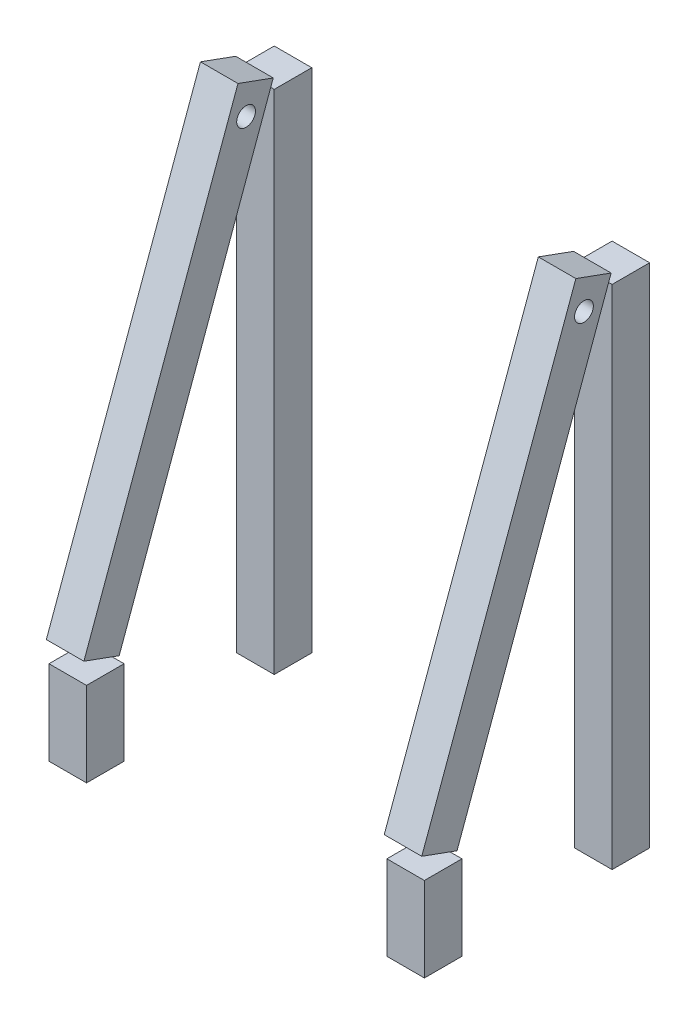
ISO-10303-21;
HEADER;
FILE_DESCRIPTION(('STEP AP214'),'2;1');
FILE_NAME('part.step','',(''),(''),'','','');
FILE_SCHEMA(('AUTOMOTIVE_DESIGN { 1 0 10303 214 1 1 1 1 }'));
ENDSEC;
DATA;
#1=APPLICATION_CONTEXT('core data for automotive mechanical design processes');
#2=APPLICATION_PROTOCOL_DEFINITION('international standard','automotive_design',2000,#1);
#3=PRODUCT_CONTEXT('',#1,'mechanical');
#4=PRODUCT('Part','Part','',(#3));
#5=PRODUCT_RELATED_PRODUCT_CATEGORY('part','',(#4));
#6=PRODUCT_DEFINITION_FORMATION('','',#4);
#7=PRODUCT_DEFINITION_CONTEXT('part definition',#1,'design');
#8=PRODUCT_DEFINITION('design','',#6,#7);
#9=PRODUCT_DEFINITION_SHAPE('','',#8);
#10=(LENGTH_UNIT() NAMED_UNIT(*) SI_UNIT(.MILLI.,.METRE.));
#11=(NAMED_UNIT(*) PLANE_ANGLE_UNIT() SI_UNIT($,.RADIAN.));
#12=(NAMED_UNIT(*) SI_UNIT($,.STERADIAN.) SOLID_ANGLE_UNIT());
#13=UNCERTAINTY_MEASURE_WITH_UNIT(LENGTH_MEASURE(1.E-05),#10,'distance_accuracy_value','');
#14=(GEOMETRIC_REPRESENTATION_CONTEXT(3) GLOBAL_UNCERTAINTY_ASSIGNED_CONTEXT((#13)) GLOBAL_UNIT_ASSIGNED_CONTEXT((#10,
#11,#12)) REPRESENTATION_CONTEXT('',''));
#15=CARTESIAN_POINT('',(0.,0.,0.));
#16=DIRECTION('',(0.,0.,1.));
#17=DIRECTION('',(1.,0.,0.));
#18=AXIS2_PLACEMENT_3D('',#15,#16,#17);
#19=CARTESIAN_POINT('',(-254.,0.,0.));
#20=DIRECTION('',(1.,0.,0.));
#21=DIRECTION('',(0.,0.,-1.));
#22=AXIS2_PLACEMENT_3D('',#19,#20,#21);
#23=PLANE('',#22);
#24=DIRECTION('',(0.,0.342020143325662,0.939692620785911));
#25=VECTOR('',#24,1.);
#26=CARTESIAN_POINT('',(-254.,123.38224622754,110.994332712899));
#27=LINE('',#26,#25);
#28=CARTESIAN_POINT('',(-254.,127.,120.934029511881));
#29=VERTEX_POINT('',#28);
#30=CARTESIAN_POINT('',(-254.,144.374623280944,168.670414647805));
#31=VERTEX_POINT('',#30);
#32=EDGE_CURVE('E99',#29,#31,#27,.T.);
#33=ORIENTED_EDGE('',*,*,#32,.T.);
#34=DIRECTION('',(0.,-0.939692620785911,0.342020143325663));
#35=VECTOR('',#34,1.);
#36=CARTESIAN_POINT('',(-254.,135.292377053404,171.976081934906));
#37=LINE('',#36,#35);
#38=CARTESIAN_POINT('',(-254.,717.211244912035,-39.8250647235188));
#39=VERTEX_POINT('',#38);
#40=EDGE_CURVE('E106',#39,#31,#37,.T.);
#41=ORIENTED_EDGE('',*,*,#40,.F.);
#42=DIRECTION('',(0.,0.342020143325662,0.939692620785911));
#43=VECTOR('',#42,1.);
#44=CARTESIAN_POINT('',(-254.,696.218867858631,-97.5011466584247));
#45=LINE('',#44,#43);
#46=CARTESIAN_POINT('',(-254.,699.836621631091,-87.5614498594431));
#47=VERTEX_POINT('',#46);
#48=EDGE_CURVE('E114',#47,#39,#45,.T.);
#49=ORIENTED_EDGE('',*,*,#48,.F.);
#50=DIRECTION('',(0.,-0.939692620785911,0.342020143325663));
#51=VECTOR('',#50,1.);
#52=CARTESIAN_POINT('',(-254.,117.91775377246,124.239696798982));
#53=LINE('',#52,#51);
#54=EDGE_CURVE('E76',#47,#29,#53,.T.);
#55=ORIENTED_EDGE('',*,*,#54,.T.);
#56=EDGE_LOOP('',(#33,#41,#49,#55));
#57=FACE_BOUND('',#56,.T.);
#58=CARTESIAN_POINT('',(-254.,673.1,-50.8));
#59=DIRECTION('',(-1.,0.,0.));
#60=DIRECTION('',(0.,0.,1.));
#61=AXIS2_PLACEMENT_3D('',#58,#59,#60);
#62=CIRCLE('',#61,12.7);
#63=CARTESIAN_POINT('',(-254.,673.1,-38.1));
#64=VERTEX_POINT('',#63);
#65=EDGE_CURVE('E125',#64,#64,#62,.T.);
#66=ORIENTED_EDGE('',*,*,#65,.F.);
#67=EDGE_LOOP('',(#66));
#68=FACE_BOUND('',#67,.T.);
#69=ADVANCED_FACE('F59',(#57,#68),#23,.F.);
#70=CARTESIAN_POINT('',(-203.2,0.,0.));
#71=DIRECTION('',(1.,0.,0.));
#72=DIRECTION('',(0.,0.,-1.));
#73=AXIS2_PLACEMENT_3D('',#70,#71,#72);
#74=PLANE('',#73);
#75=DIRECTION('',(0.,0.342020143325662,0.939692620785911));
#76=VECTOR('',#75,1.);
#77=CARTESIAN_POINT('',(-203.2,123.38224622754,110.994332712899));
#78=LINE('',#77,#76);
#79=CARTESIAN_POINT('',(-203.2,127.,120.934029511881));
#80=VERTEX_POINT('',#79);
#81=CARTESIAN_POINT('',(-203.2,144.374623280944,168.670414647805));
#82=VERTEX_POINT('',#81);
#83=EDGE_CURVE('E122',#80,#82,#78,.T.);
#84=ORIENTED_EDGE('',*,*,#83,.F.);
#85=DIRECTION('',(0.,-0.939692620785911,0.342020143325663));
#86=VECTOR('',#85,1.);
#87=CARTESIAN_POINT('',(-203.2,117.91775377246,124.239696798982));
#88=LINE('',#87,#86);
#89=CARTESIAN_POINT('',(-203.2,699.836621631091,-87.5614498594431));
#90=VERTEX_POINT('',#89);
#91=EDGE_CURVE('E94',#90,#80,#88,.T.);
#92=ORIENTED_EDGE('',*,*,#91,.F.);
#93=DIRECTION('',(0.,0.342020143325662,0.939692620785911));
#94=VECTOR('',#93,1.);
#95=CARTESIAN_POINT('',(-203.2,696.218867858631,-97.5011466584247));
#96=LINE('',#95,#94);
#97=CARTESIAN_POINT('',(-203.2,717.211244912035,-39.8250647235188));
#98=VERTEX_POINT('',#97);
#99=EDGE_CURVE('E127',#90,#98,#96,.T.);
#100=ORIENTED_EDGE('',*,*,#99,.T.);
#101=DIRECTION('',(0.,-0.939692620785911,0.342020143325663));
#102=VECTOR('',#101,1.);
#103=CARTESIAN_POINT('',(-203.2,135.292377053404,171.976081934906));
#104=LINE('',#103,#102);
#105=EDGE_CURVE('E108',#98,#82,#104,.T.);
#106=ORIENTED_EDGE('',*,*,#105,.T.);
#107=EDGE_LOOP('',(#84,#92,#100,#106));
#108=FACE_BOUND('',#107,.T.);
#109=CARTESIAN_POINT('',(-203.2,673.1,-50.8));
#110=DIRECTION('',(-1.,0.,0.));
#111=DIRECTION('',(0.,0.,1.));
#112=AXIS2_PLACEMENT_3D('',#109,#110,#111);
#113=CIRCLE('',#112,12.7);
#114=CARTESIAN_POINT('',(-203.2,673.1,-38.1));
#115=VERTEX_POINT('',#114);
#116=EDGE_CURVE('E140',#115,#115,#113,.T.);
#117=ORIENTED_EDGE('',*,*,#116,.T.);
#118=EDGE_LOOP('',(#117));
#119=FACE_BOUND('',#118,.T.);
#120=ADVANCED_FACE('F134',(#108,#119),#74,.T.);
#121=CARTESIAN_POINT('',(-254.,123.38224622754,110.994332712899));
#122=DIRECTION('',(0.,0.939692620785911,-0.342020143325662));
#123=DIRECTION('',(0.,0.342020143325662,0.939692620785911));
#124=AXIS2_PLACEMENT_3D('',#121,#122,#123);
#125=PLANE('',#124);
#126=ORIENTED_EDGE('',*,*,#83,.T.);
#127=DIRECTION('',(1.,0.,0.));
#128=VECTOR('',#127,1.);
#129=CARTESIAN_POINT('',(-254.,144.374623280944,168.670414647805));
#130=LINE('',#129,#128);
#131=EDGE_CURVE('E13',#31,#82,#130,.T.);
#132=ORIENTED_EDGE('',*,*,#131,.F.);
#133=ORIENTED_EDGE('',*,*,#32,.F.);
#134=DIRECTION('',(1.,0.,0.));
#135=VECTOR('',#134,1.);
#136=CARTESIAN_POINT('',(-254.,127.,120.934029511881));
#137=LINE('',#136,#135);
#138=EDGE_CURVE('E118',#29,#80,#137,.T.);
#139=ORIENTED_EDGE('',*,*,#138,.T.);
#140=EDGE_LOOP('',(#126,#132,#133,#139));
#141=FACE_BOUND('',#140,.T.);
#142=ADVANCED_FACE('F61',(#141),#125,.F.);
#143=CARTESIAN_POINT('',(-254.,135.292377053404,171.976081934906));
#144=DIRECTION('',(0.,0.342020143325663,0.939692620785911));
#145=DIRECTION('',(0.,-0.939692620785911,0.342020143325663));
#146=AXIS2_PLACEMENT_3D('',#143,#144,#145);
#147=PLANE('',#146);
#148=ORIENTED_EDGE('',*,*,#105,.F.);
#149=DIRECTION('',(1.,0.,0.));
#150=VECTOR('',#149,1.);
#151=CARTESIAN_POINT('',(-254.,717.211244912035,-39.8250647235188));
#152=LINE('',#151,#150);
#153=EDGE_CURVE('E68',#39,#98,#152,.T.);
#154=ORIENTED_EDGE('',*,*,#153,.F.);
#155=ORIENTED_EDGE('',*,*,#40,.T.);
#156=ORIENTED_EDGE('',*,*,#131,.T.);
#157=EDGE_LOOP('',(#148,#154,#155,#156));
#158=FACE_BOUND('',#157,.T.);
#159=ADVANCED_FACE('F105',(#158),#147,.T.);
#160=CARTESIAN_POINT('',(-254.,696.218867858631,-97.5011466584247));
#161=DIRECTION('',(0.,0.939692620785911,-0.342020143325662));
#162=DIRECTION('',(0.,0.342020143325662,0.939692620785911));
#163=AXIS2_PLACEMENT_3D('',#160,#161,#162);
#164=PLANE('',#163);
#165=ORIENTED_EDGE('',*,*,#99,.F.);
#166=DIRECTION('',(1.,0.,0.));
#167=VECTOR('',#166,1.);
#168=CARTESIAN_POINT('',(-254.,699.836621631091,-87.5614498594431));
#169=LINE('',#168,#167);
#170=EDGE_CURVE('E91',#47,#90,#169,.T.);
#171=ORIENTED_EDGE('',*,*,#170,.F.);
#172=ORIENTED_EDGE('',*,*,#48,.T.);
#173=ORIENTED_EDGE('',*,*,#153,.T.);
#174=EDGE_LOOP('',(#165,#171,#172,#173));
#175=FACE_BOUND('',#174,.T.);
#176=ADVANCED_FACE('F116',(#175),#164,.T.);
#177=CARTESIAN_POINT('',(-254.,117.91775377246,124.239696798982));
#178=DIRECTION('',(0.,0.342020143325663,0.939692620785911));
#179=DIRECTION('',(0.,-0.939692620785911,0.342020143325663));
#180=AXIS2_PLACEMENT_3D('',#177,#178,#179);
#181=PLANE('',#180);
#182=ORIENTED_EDGE('',*,*,#91,.T.);
#183=ORIENTED_EDGE('',*,*,#138,.F.);
#184=ORIENTED_EDGE('',*,*,#54,.F.);
#185=ORIENTED_EDGE('',*,*,#170,.T.);
#186=EDGE_LOOP('',(#182,#183,#184,#185));
#187=FACE_BOUND('',#186,.T.);
#188=ADVANCED_FACE('F154',(#187),#181,.F.);
#189=CARTESIAN_POINT('',(-254.,673.1,-50.8));
#190=DIRECTION('',(1.,0.,0.));
#191=DIRECTION('',(0.,0.,-1.));
#192=AXIS2_PLACEMENT_3D('',#189,#190,#191);
#193=CYLINDRICAL_SURFACE('',#192,12.7);
#194=ORIENTED_EDGE('',*,*,#65,.T.);
#195=EDGE_LOOP('',(#194));
#196=FACE_BOUND('',#195,.T.);
#197=ORIENTED_EDGE('',*,*,#116,.F.);
#198=EDGE_LOOP('',(#197));
#199=FACE_BOUND('',#198,.T.);
#200=ADVANCED_FACE('F147',(#196,#199),#193,.F.);
#201=CLOSED_SHELL('',(#69,#120,#142,#159,#176,#188,#200));
#202=MANIFOLD_SOLID_BREP('B2',#201);
#203=CARTESIAN_POINT('',(203.2,646.112995889296,-235.16589847626));
#204=DIRECTION('',(0.,-0.939692620785911,0.342020143325662));
#205=DIRECTION('',(0.,-0.342020143325662,-0.939692620785911));
#206=AXIS2_PLACEMENT_3D('',#203,#204,#205);
#207=PLANE('',#206);
#208=DIRECTION('',(0.,-0.342020143325662,-0.939692620785911));
#209=VECTOR('',#208,1.);
#210=CARTESIAN_POINT('',(254.,646.112995889296,-235.16589847626));
#211=LINE('',#210,#209);
#212=CARTESIAN_POINT('',(254.,717.211244912035,-39.8250647235188));
#213=VERTEX_POINT('',#212);
#214=CARTESIAN_POINT('',(254.,699.836621631091,-87.561449859443));
#215=VERTEX_POINT('',#214);
#216=EDGE_CURVE('E280',#213,#215,#211,.T.);
#217=ORIENTED_EDGE('',*,*,#216,.T.);
#218=DIRECTION('',(1.,0.,0.));
#219=VECTOR('',#218,1.);
#220=CARTESIAN_POINT('',(203.2,699.836621631091,-87.561449859443));
#221=LINE('',#220,#219);
#222=CARTESIAN_POINT('',(203.2,699.836621631091,-87.561449859443));
#223=VERTEX_POINT('',#222);
#224=EDGE_CURVE('E57',#223,#215,#221,.T.);
#225=ORIENTED_EDGE('',*,*,#224,.F.);
#226=DIRECTION('',(0.,-0.342020143325662,-0.939692620785911));
#227=VECTOR('',#226,1.);
#228=CARTESIAN_POINT('',(203.2,646.112995889296,-235.16589847626));
#229=LINE('',#228,#227);
#230=CARTESIAN_POINT('',(203.2,717.211244912035,-39.8250647235188));
#231=VERTEX_POINT('',#230);
#232=EDGE_CURVE('E233',#231,#223,#229,.T.);
#233=ORIENTED_EDGE('',*,*,#232,.F.);
#234=DIRECTION('',(1.,0.,0.));
#235=VECTOR('',#234,1.);
#236=CARTESIAN_POINT('',(203.2,717.211244912035,-39.8250647235188));
#237=LINE('',#236,#235);
#238=EDGE_CURVE('E218',#231,#213,#237,.T.);
#239=ORIENTED_EDGE('',*,*,#238,.T.);
#240=EDGE_LOOP('',(#217,#225,#233,#239));
#241=FACE_BOUND('',#240,.T.);
#242=ADVANCED_FACE('F214',(#241),#207,.F.);
#243=CARTESIAN_POINT('',(203.2,53.7236257417955,147.604448616817));
#244=DIRECTION('',(0.,-0.342020143325663,-0.939692620785911));
#245=DIRECTION('',(0.,0.939692620785911,-0.342020143325663));
#246=AXIS2_PLACEMENT_3D('',#243,#244,#245);
#247=PLANE('',#246);
#248=DIRECTION('',(0.,0.939692620785911,-0.342020143325663));
#249=VECTOR('',#248,1.);
#250=CARTESIAN_POINT('',(254.,53.7236257417955,147.604448616817));
#251=LINE('',#250,#249);
#252=CARTESIAN_POINT('',(254.,127.,120.934029511881));
#253=VERTEX_POINT('',#252);
#254=EDGE_CURVE('E285',#253,#215,#251,.T.);
#255=ORIENTED_EDGE('',*,*,#254,.F.);
#256=DIRECTION('',(1.,0.,0.));
#257=VECTOR('',#256,1.);
#258=CARTESIAN_POINT('',(203.2,127.,120.934029511881));
#259=LINE('',#258,#257);
#260=CARTESIAN_POINT('',(203.2,127.,120.934029511881));
#261=VERTEX_POINT('',#260);
#262=EDGE_CURVE('E224',#261,#253,#259,.T.);
#263=ORIENTED_EDGE('',*,*,#262,.F.);
#264=DIRECTION('',(0.,0.939692620785911,-0.342020143325663));
#265=VECTOR('',#264,1.);
#266=CARTESIAN_POINT('',(203.2,53.7236257417955,147.604448616817));
#267=LINE('',#266,#265);
#268=EDGE_CURVE('E272',#261,#223,#267,.T.);
#269=ORIENTED_EDGE('',*,*,#268,.T.);
#270=ORIENTED_EDGE('',*,*,#224,.T.);
#271=EDGE_LOOP('',(#255,#263,#269,#270));
#272=FACE_BOUND('',#271,.T.);
#273=ADVANCED_FACE('F304',(#272),#247,.T.);
#274=CARTESIAN_POINT('',(203.2,73.2763742582046,-26.6704191049361));
#275=DIRECTION('',(0.,-0.939692620785911,0.342020143325662));
#276=DIRECTION('',(0.,-0.342020143325662,-0.939692620785911));
#277=AXIS2_PLACEMENT_3D('',#274,#275,#276);
#278=PLANE('',#277);
#279=DIRECTION('',(0.,-0.342020143325662,-0.939692620785911));
#280=VECTOR('',#279,1.);
#281=CARTESIAN_POINT('',(254.,73.2763742582046,-26.6704191049361));
#282=LINE('',#281,#280);
#283=CARTESIAN_POINT('',(254.,144.374623280944,168.670414647805));
#284=VERTEX_POINT('',#283);
#285=EDGE_CURVE('E265',#284,#253,#282,.T.);
#286=ORIENTED_EDGE('',*,*,#285,.F.);
#287=DIRECTION('',(1.,0.,0.));
#288=VECTOR('',#287,1.);
#289=CARTESIAN_POINT('',(203.2,144.374623280944,168.670414647805));
#290=LINE('',#289,#288);
#291=CARTESIAN_POINT('',(203.2,144.374623280944,168.670414647805));
#292=VERTEX_POINT('',#291);
#293=EDGE_CURVE('E262',#292,#284,#290,.T.);
#294=ORIENTED_EDGE('',*,*,#293,.F.);
#295=DIRECTION('',(0.,-0.342020143325662,-0.939692620785911));
#296=VECTOR('',#295,1.);
#297=CARTESIAN_POINT('',(203.2,73.2763742582046,-26.6704191049361));
#298=LINE('',#297,#296);
#299=EDGE_CURVE('E264',#292,#261,#298,.T.);
#300=ORIENTED_EDGE('',*,*,#299,.T.);
#301=ORIENTED_EDGE('',*,*,#262,.T.);
#302=EDGE_LOOP('',(#286,#294,#300,#301));
#303=FACE_BOUND('',#302,.T.);
#304=ADVANCED_FACE('F263',(#303),#278,.T.);
#305=CARTESIAN_POINT('',(203.2,673.1,-50.8));
#306=DIRECTION('',(1.,0.,0.));
#307=DIRECTION('',(0.,0.,-1.));
#308=AXIS2_PLACEMENT_3D('',#305,#306,#307);
#309=CYLINDRICAL_SURFACE('',#308,12.7);
#310=CARTESIAN_POINT('',(203.2,673.1,-50.8));
#311=DIRECTION('',(1.,0.,0.));
#312=DIRECTION('',(0.,0.,-1.));
#313=AXIS2_PLACEMENT_3D('',#310,#311,#312);
#314=CIRCLE('',#313,12.7);
#315=CARTESIAN_POINT('',(203.2,673.1,-63.5));
#316=VERTEX_POINT('',#315);
#317=EDGE_CURVE('E287',#316,#316,#314,.T.);
#318=ORIENTED_EDGE('',*,*,#317,.F.);
#319=EDGE_LOOP('',(#318));
#320=FACE_BOUND('',#319,.T.);
#321=CARTESIAN_POINT('',(254.,673.1,-50.8));
#322=DIRECTION('',(1.,0.,0.));
#323=DIRECTION('',(0.,0.,-1.));
#324=AXIS2_PLACEMENT_3D('',#321,#322,#323);
#325=CIRCLE('',#324,12.7);
#326=CARTESIAN_POINT('',(254.,673.1,-63.5));
#327=VERTEX_POINT('',#326);
#328=EDGE_CURVE('E277',#327,#327,#325,.T.);
#329=ORIENTED_EDGE('',*,*,#328,.T.);
#330=EDGE_LOOP('',(#329));
#331=FACE_BOUND('',#330,.T.);
#332=ADVANCED_FACE('F216',(#320,#331),#309,.F.);
#333=CARTESIAN_POINT('',(203.2,71.0982490227391,195.340833752741));
#334=DIRECTION('',(0.,-0.342020143325663,-0.939692620785911));
#335=DIRECTION('',(0.,0.939692620785911,-0.342020143325663));
#336=AXIS2_PLACEMENT_3D('',#333,#334,#335);
#337=PLANE('',#336);
#338=DIRECTION('',(0.,0.939692620785911,-0.342020143325663));
#339=VECTOR('',#338,1.);
#340=CARTESIAN_POINT('',(254.,71.0982490227391,195.340833752741));
#341=LINE('',#340,#339);
#342=EDGE_CURVE('E282',#284,#213,#341,.T.);
#343=ORIENTED_EDGE('',*,*,#342,.T.);
#344=ORIENTED_EDGE('',*,*,#238,.F.);
#345=DIRECTION('',(0.,0.939692620785911,-0.342020143325663));
#346=VECTOR('',#345,1.);
#347=CARTESIAN_POINT('',(203.2,71.0982490227391,195.340833752741));
#348=LINE('',#347,#346);
#349=EDGE_CURVE('E259',#292,#231,#348,.T.);
#350=ORIENTED_EDGE('',*,*,#349,.F.);
#351=ORIENTED_EDGE('',*,*,#293,.T.);
#352=EDGE_LOOP('',(#343,#344,#350,#351));
#353=FACE_BOUND('',#352,.T.);
#354=ADVANCED_FACE('F268',(#353),#337,.F.);
#355=CARTESIAN_POINT('',(203.2,0.,0.));
#356=DIRECTION('',(1.,0.,0.));
#357=DIRECTION('',(0.,0.,-1.));
#358=AXIS2_PLACEMENT_3D('',#355,#356,#357);
#359=PLANE('',#358);
#360=ORIENTED_EDGE('',*,*,#317,.T.);
#361=EDGE_LOOP('',(#360));
#362=FACE_BOUND('',#361,.T.);
#363=ORIENTED_EDGE('',*,*,#232,.T.);
#364=ORIENTED_EDGE('',*,*,#268,.F.);
#365=ORIENTED_EDGE('',*,*,#299,.F.);
#366=ORIENTED_EDGE('',*,*,#349,.T.);
#367=EDGE_LOOP('',(#363,#364,#365,#366));
#368=FACE_BOUND('',#367,.T.);
#369=ADVANCED_FACE('F271',(#362,#368),#359,.F.);
#370=CARTESIAN_POINT('',(254.,0.,0.));
#371=DIRECTION('',(1.,0.,0.));
#372=DIRECTION('',(0.,0.,-1.));
#373=AXIS2_PLACEMENT_3D('',#370,#371,#372);
#374=PLANE('',#373);
#375=ORIENTED_EDGE('',*,*,#328,.F.);
#376=EDGE_LOOP('',(#375));
#377=FACE_BOUND('',#376,.T.);
#378=ORIENTED_EDGE('',*,*,#216,.F.);
#379=ORIENTED_EDGE('',*,*,#342,.F.);
#380=ORIENTED_EDGE('',*,*,#285,.T.);
#381=ORIENTED_EDGE('',*,*,#254,.T.);
#382=EDGE_LOOP('',(#378,#379,#380,#381));
#383=FACE_BOUND('',#382,.T.);
#384=ADVANCED_FACE('F300',(#377,#383),#374,.T.);
#385=CLOSED_SHELL('',(#242,#273,#304,#332,#354,#369,#384));
#386=MANIFOLD_SOLID_BREP('B7',#385);
#387=CARTESIAN_POINT('',(-254.,114.3,114.3));
#388=DIRECTION('',(1.,0.,0.));
#389=DIRECTION('',(0.,0.,-1.));
#390=AXIS2_PLACEMENT_3D('',#387,#388,#389);
#391=PLANE('',#390);
#392=DIRECTION('',(0.,0.,1.));
#393=VECTOR('',#392,1.);
#394=CARTESIAN_POINT('',(-254.,0.,114.3));
#395=LINE('',#394,#393);
#396=CARTESIAN_POINT('',(-254.,0.,114.3));
#397=VERTEX_POINT('',#396);
#398=CARTESIAN_POINT('',(-254.,0.,165.1));
#399=VERTEX_POINT('',#398);
#400=EDGE_CURVE('E432',#397,#399,#395,.T.);
#401=ORIENTED_EDGE('',*,*,#400,.T.);
#402=DIRECTION('',(0.,-1.,0.));
#403=VECTOR('',#402,1.);
#404=CARTESIAN_POINT('',(-254.,114.3,165.1));
#405=LINE('',#404,#403);
#406=CARTESIAN_POINT('',(-254.,114.3,165.1));
#407=VERTEX_POINT('',#406);
#408=EDGE_CURVE('E212',#407,#399,#405,.T.);
#409=ORIENTED_EDGE('',*,*,#408,.F.);
#410=DIRECTION('',(0.,0.,1.));
#411=VECTOR('',#410,1.);
#412=CARTESIAN_POINT('',(-254.,114.3,114.3));
#413=LINE('',#412,#411);
#414=CARTESIAN_POINT('',(-254.,114.3,114.3));
#415=VERTEX_POINT('',#414);
#416=EDGE_CURVE('E420',#415,#407,#413,.T.);
#417=ORIENTED_EDGE('',*,*,#416,.F.);
#418=DIRECTION('',(0.,-1.,0.));
#419=VECTOR('',#418,1.);
#420=CARTESIAN_POINT('',(-254.,114.3,114.3));
#421=LINE('',#420,#419);
#422=EDGE_CURVE('E428',#415,#397,#421,.T.);
#423=ORIENTED_EDGE('',*,*,#422,.T.);
#424=EDGE_LOOP('',(#401,#409,#417,#423));
#425=FACE_BOUND('',#424,.T.);
#426=ADVANCED_FACE('F369',(#425),#391,.F.);
#427=CARTESIAN_POINT('',(-254.,114.3,165.1));
#428=DIRECTION('',(0.,0.,-1.));
#429=DIRECTION('',(-1.,0.,0.));
#430=AXIS2_PLACEMENT_3D('',#427,#428,#429);
#431=PLANE('',#430);
#432=DIRECTION('',(1.,0.,0.));
#433=VECTOR('',#432,1.);
#434=CARTESIAN_POINT('',(-254.,0.,165.1));
#435=LINE('',#434,#433);
#436=CARTESIAN_POINT('',(-203.2,0.,165.1));
#437=VERTEX_POINT('',#436);
#438=EDGE_CURVE('E424',#399,#437,#435,.T.);
#439=ORIENTED_EDGE('',*,*,#438,.T.);
#440=DIRECTION('',(0.,-1.,0.));
#441=VECTOR('',#440,1.);
#442=CARTESIAN_POINT('',(-203.2,114.3,165.1));
#443=LINE('',#442,#441);
#444=CARTESIAN_POINT('',(-203.2,114.3,165.1));
#445=VERTEX_POINT('',#444);
#446=EDGE_CURVE('E377',#445,#437,#443,.T.);
#447=ORIENTED_EDGE('',*,*,#446,.F.);
#448=DIRECTION('',(1.,0.,0.));
#449=VECTOR('',#448,1.);
#450=CARTESIAN_POINT('',(-254.,114.3,165.1));
#451=LINE('',#450,#449);
#452=EDGE_CURVE('E415',#407,#445,#451,.T.);
#453=ORIENTED_EDGE('',*,*,#452,.F.);
#454=ORIENTED_EDGE('',*,*,#408,.T.);
#455=EDGE_LOOP('',(#439,#447,#453,#454));
#456=FACE_BOUND('',#455,.T.);
#457=ADVANCED_FACE('F423',(#456),#431,.F.);
#458=CARTESIAN_POINT('',(-203.2,114.3,114.3));
#459=DIRECTION('',(-1.,0.,0.));
#460=DIRECTION('',(0.,0.,1.));
#461=AXIS2_PLACEMENT_3D('',#458,#459,#460);
#462=PLANE('',#461);
#463=DIRECTION('',(0.,0.,-1.));
#464=VECTOR('',#463,1.);
#465=CARTESIAN_POINT('',(-203.2,0.,114.3));
#466=LINE('',#465,#464);
#467=CARTESIAN_POINT('',(-203.2,0.,114.3));
#468=VERTEX_POINT('',#467);
#469=EDGE_CURVE('E402',#437,#468,#466,.T.);
#470=ORIENTED_EDGE('',*,*,#469,.T.);
#471=DIRECTION('',(0.,-1.,0.));
#472=VECTOR('',#471,1.);
#473=CARTESIAN_POINT('',(-203.2,114.3,114.3));
#474=LINE('',#473,#472);
#475=CARTESIAN_POINT('',(-203.2,114.3,114.3));
#476=VERTEX_POINT('',#475);
#477=EDGE_CURVE('E425',#476,#468,#474,.T.);
#478=ORIENTED_EDGE('',*,*,#477,.F.);
#479=DIRECTION('',(0.,0.,-1.));
#480=VECTOR('',#479,1.);
#481=CARTESIAN_POINT('',(-203.2,114.3,114.3));
#482=LINE('',#481,#480);
#483=EDGE_CURVE('E418',#445,#476,#482,.T.);
#484=ORIENTED_EDGE('',*,*,#483,.F.);
#485=ORIENTED_EDGE('',*,*,#446,.T.);
#486=EDGE_LOOP('',(#470,#478,#484,#485));
#487=FACE_BOUND('',#486,.T.);
#488=ADVANCED_FACE('F426',(#487),#462,.F.);
#489=CARTESIAN_POINT('',(-254.,114.3,114.3));
#490=DIRECTION('',(0.,0.,1.));
#491=DIRECTION('',(1.,0.,0.));
#492=AXIS2_PLACEMENT_3D('',#489,#490,#491);
#493=PLANE('',#492);
#494=DIRECTION('',(-1.,0.,0.));
#495=VECTOR('',#494,1.);
#496=CARTESIAN_POINT('',(-254.,0.,114.3));
#497=LINE('',#496,#495);
#498=EDGE_CURVE('E408',#468,#397,#497,.T.);
#499=ORIENTED_EDGE('',*,*,#498,.T.);
#500=ORIENTED_EDGE('',*,*,#422,.F.);
#501=DIRECTION('',(-1.,0.,0.));
#502=VECTOR('',#501,1.);
#503=CARTESIAN_POINT('',(-254.,114.3,114.3));
#504=LINE('',#503,#502);
#505=EDGE_CURVE('E385',#476,#415,#504,.T.);
#506=ORIENTED_EDGE('',*,*,#505,.F.);
#507=ORIENTED_EDGE('',*,*,#477,.T.);
#508=EDGE_LOOP('',(#499,#500,#506,#507));
#509=FACE_BOUND('',#508,.T.);
#510=ADVANCED_FACE('F439',(#509),#493,.F.);
#511=CARTESIAN_POINT('',(0.,114.3,0.));
#512=DIRECTION('',(0.,1.,0.));
#513=DIRECTION('',(0.,0.,1.));
#514=AXIS2_PLACEMENT_3D('',#511,#512,#513);
#515=PLANE('',#514);
#516=ORIENTED_EDGE('',*,*,#416,.T.);
#517=ORIENTED_EDGE('',*,*,#452,.T.);
#518=ORIENTED_EDGE('',*,*,#483,.T.);
#519=ORIENTED_EDGE('',*,*,#505,.T.);
#520=EDGE_LOOP('',(#516,#517,#518,#519));
#521=FACE_BOUND('',#520,.T.);
#522=ADVANCED_FACE('F416',(#521),#515,.T.);
#523=CARTESIAN_POINT('',(0.,0.,0.));
#524=DIRECTION('',(0.,1.,0.));
#525=DIRECTION('',(0.,0.,1.));
#526=AXIS2_PLACEMENT_3D('',#523,#524,#525);
#527=PLANE('',#526);
#528=ORIENTED_EDGE('',*,*,#400,.F.);
#529=ORIENTED_EDGE('',*,*,#498,.F.);
#530=ORIENTED_EDGE('',*,*,#469,.F.);
#531=ORIENTED_EDGE('',*,*,#438,.F.);
#532=EDGE_LOOP('',(#528,#529,#530,#531));
#533=FACE_BOUND('',#532,.T.);
#534=ADVANCED_FACE('F442',(#533),#527,.F.);
#535=CLOSED_SHELL('',(#426,#457,#488,#510,#522,#534));
#536=MANIFOLD_SOLID_BREP('B51',#535);
#537=CARTESIAN_POINT('',(-254.,114.3,-139.7));
#538=DIRECTION('',(1.,0.,0.));
#539=DIRECTION('',(0.,0.,-1.));
#540=AXIS2_PLACEMENT_3D('',#537,#538,#539);
#541=PLANE('',#540);
#542=DIRECTION('',(0.,0.,1.));
#543=VECTOR('',#542,1.);
#544=CARTESIAN_POINT('',(-254.,0.,-139.7));
#545=LINE('',#544,#543);
#546=CARTESIAN_POINT('',(-254.,0.,-139.7));
#547=VERTEX_POINT('',#546);
#548=CARTESIAN_POINT('',(-254.,0.,-88.9));
#549=VERTEX_POINT('',#548);
#550=EDGE_CURVE('E567',#547,#549,#545,.T.);
#551=ORIENTED_EDGE('',*,*,#550,.T.);
#552=DIRECTION('',(0.,-1.,0.));
#553=VECTOR('',#552,1.);
#554=CARTESIAN_POINT('',(-254.,114.3,-88.9));
#555=LINE('',#554,#553);
#556=CARTESIAN_POINT('',(-254.,685.8,-88.9));
#557=VERTEX_POINT('',#556);
#558=EDGE_CURVE('E367',#557,#549,#555,.T.);
#559=ORIENTED_EDGE('',*,*,#558,.F.);
#560=DIRECTION('',(0.,0.,1.));
#561=VECTOR('',#560,1.);
#562=CARTESIAN_POINT('',(-254.,685.8,-139.7));
#563=LINE('',#562,#561);
#564=CARTESIAN_POINT('',(-254.,685.8,-139.7));
#565=VERTEX_POINT('',#564);
#566=EDGE_CURVE('E553',#565,#557,#563,.T.);
#567=ORIENTED_EDGE('',*,*,#566,.F.);
#568=DIRECTION('',(0.,-1.,0.));
#569=VECTOR('',#568,1.);
#570=CARTESIAN_POINT('',(-254.,114.3,-139.7));
#571=LINE('',#570,#569);
#572=EDGE_CURVE('E542',#565,#547,#571,.T.);
#573=ORIENTED_EDGE('',*,*,#572,.T.);
#574=EDGE_LOOP('',(#551,#559,#567,#573));
#575=FACE_BOUND('',#574,.T.);
#576=ADVANCED_FACE('F503',(#575),#541,.F.);
#577=CARTESIAN_POINT('',(-254.,114.3,-88.9));
#578=DIRECTION('',(0.,0.,-1.));
#579=DIRECTION('',(-1.,0.,0.));
#580=AXIS2_PLACEMENT_3D('',#577,#578,#579);
#581=PLANE('',#580);
#582=DIRECTION('',(1.,0.,0.));
#583=VECTOR('',#582,1.);
#584=CARTESIAN_POINT('',(-254.,0.,-88.9));
#585=LINE('',#584,#583);
#586=CARTESIAN_POINT('',(-203.2,0.,-88.9));
#587=VERTEX_POINT('',#586);
#588=EDGE_CURVE('E569',#549,#587,#585,.T.);
#589=ORIENTED_EDGE('',*,*,#588,.T.);
#590=DIRECTION('',(0.,-1.,0.));
#591=VECTOR('',#590,1.);
#592=CARTESIAN_POINT('',(-203.2,114.3,-88.9));
#593=LINE('',#592,#591);
#594=CARTESIAN_POINT('',(-203.2,685.8,-88.9));
#595=VERTEX_POINT('',#594);
#596=EDGE_CURVE('E510',#595,#587,#593,.T.);
#597=ORIENTED_EDGE('',*,*,#596,.F.);
#598=DIRECTION('',(1.,0.,0.));
#599=VECTOR('',#598,1.);
#600=CARTESIAN_POINT('',(-254.,685.8,-88.9));
#601=LINE('',#600,#599);
#602=EDGE_CURVE('E557',#557,#595,#601,.T.);
#603=ORIENTED_EDGE('',*,*,#602,.F.);
#604=ORIENTED_EDGE('',*,*,#558,.T.);
#605=EDGE_LOOP('',(#589,#597,#603,#604));
#606=FACE_BOUND('',#605,.T.);
#607=ADVANCED_FACE('F577',(#606),#581,.F.);
#608=CARTESIAN_POINT('',(-203.2,114.3,-139.7));
#609=DIRECTION('',(-1.,0.,0.));
#610=DIRECTION('',(0.,0.,1.));
#611=AXIS2_PLACEMENT_3D('',#608,#609,#610);
#612=PLANE('',#611);
#613=DIRECTION('',(0.,0.,-1.));
#614=VECTOR('',#613,1.);
#615=CARTESIAN_POINT('',(-203.2,0.,-139.7));
#616=LINE('',#615,#614);
#617=CARTESIAN_POINT('',(-203.2,0.,-139.7));
#618=VERTEX_POINT('',#617);
#619=EDGE_CURVE('E525',#587,#618,#616,.T.);
#620=ORIENTED_EDGE('',*,*,#619,.T.);
#621=DIRECTION('',(0.,-1.,0.));
#622=VECTOR('',#621,1.);
#623=CARTESIAN_POINT('',(-203.2,114.3,-139.7));
#624=LINE('',#623,#622);
#625=CARTESIAN_POINT('',(-203.2,685.8,-139.7));
#626=VERTEX_POINT('',#625);
#627=EDGE_CURVE('E550',#626,#618,#624,.T.);
#628=ORIENTED_EDGE('',*,*,#627,.F.);
#629=DIRECTION('',(0.,0.,-1.));
#630=VECTOR('',#629,1.);
#631=CARTESIAN_POINT('',(-203.2,685.8,-88.9));
#632=LINE('',#631,#630);
#633=EDGE_CURVE('E562',#595,#626,#632,.T.);
#634=ORIENTED_EDGE('',*,*,#633,.F.);
#635=ORIENTED_EDGE('',*,*,#596,.T.);
#636=EDGE_LOOP('',(#620,#628,#634,#635));
#637=FACE_BOUND('',#636,.T.);
#638=ADVANCED_FACE('F573',(#637),#612,.F.);
#639=CARTESIAN_POINT('',(-254.,114.3,-139.7));
#640=DIRECTION('',(0.,0.,1.));
#641=DIRECTION('',(1.,0.,0.));
#642=AXIS2_PLACEMENT_3D('',#639,#640,#641);
#643=PLANE('',#642);
#644=DIRECTION('',(-1.,0.,0.));
#645=VECTOR('',#644,1.);
#646=CARTESIAN_POINT('',(-254.,0.,-139.7));
#647=LINE('',#646,#645);
#648=EDGE_CURVE('E517',#618,#547,#647,.T.);
#649=ORIENTED_EDGE('',*,*,#648,.T.);
#650=ORIENTED_EDGE('',*,*,#572,.F.);
#651=DIRECTION('',(-1.,0.,0.));
#652=VECTOR('',#651,1.);
#653=CARTESIAN_POINT('',(-203.2,685.8,-139.7));
#654=LINE('',#653,#652);
#655=EDGE_CURVE('E546',#626,#565,#654,.T.);
#656=ORIENTED_EDGE('',*,*,#655,.F.);
#657=ORIENTED_EDGE('',*,*,#627,.T.);
#658=EDGE_LOOP('',(#649,#650,#656,#657));
#659=FACE_BOUND('',#658,.T.);
#660=ADVANCED_FACE('F544',(#659),#643,.F.);
#661=CARTESIAN_POINT('',(0.,0.,0.));
#662=DIRECTION('',(0.,1.,0.));
#663=DIRECTION('',(0.,0.,1.));
#664=AXIS2_PLACEMENT_3D('',#661,#662,#663);
#665=PLANE('',#664);
#666=ORIENTED_EDGE('',*,*,#550,.F.);
#667=ORIENTED_EDGE('',*,*,#648,.F.);
#668=ORIENTED_EDGE('',*,*,#619,.F.);
#669=ORIENTED_EDGE('',*,*,#588,.F.);
#670=EDGE_LOOP('',(#666,#667,#668,#669));
#671=FACE_BOUND('',#670,.T.);
#672=ADVANCED_FACE('F576',(#671),#665,.F.);
#673=CARTESIAN_POINT('',(0.,685.8,0.));
#674=DIRECTION('',(0.,1.,0.));
#675=DIRECTION('',(0.,0.,1.));
#676=AXIS2_PLACEMENT_3D('',#673,#674,#675);
#677=PLANE('',#676);
#678=ORIENTED_EDGE('',*,*,#655,.T.);
#679=ORIENTED_EDGE('',*,*,#566,.T.);
#680=ORIENTED_EDGE('',*,*,#602,.T.);
#681=ORIENTED_EDGE('',*,*,#633,.T.);
#682=EDGE_LOOP('',(#678,#679,#680,#681));
#683=FACE_BOUND('',#682,.T.);
#684=ADVANCED_FACE('F560',(#683),#677,.T.);
#685=CLOSED_SHELL('',(#576,#607,#638,#660,#672,#684));
#686=MANIFOLD_SOLID_BREP('B206',#685);
#687=CARTESIAN_POINT('',(203.2,114.3,114.3));
#688=DIRECTION('',(1.,0.,0.));
#689=DIRECTION('',(0.,0.,-1.));
#690=AXIS2_PLACEMENT_3D('',#687,#688,#689);
#691=PLANE('',#690);
#692=DIRECTION('',(0.,0.,1.));
#693=VECTOR('',#692,1.);
#694=CARTESIAN_POINT('',(203.2,0.,114.3));
#695=LINE('',#694,#693);
#696=CARTESIAN_POINT('',(203.2,0.,114.3));
#697=VERTEX_POINT('',#696);
#698=CARTESIAN_POINT('',(203.2,0.,165.1));
#699=VERTEX_POINT('',#698);
#700=EDGE_CURVE('E711',#697,#699,#695,.T.);
#701=ORIENTED_EDGE('',*,*,#700,.T.);
#702=DIRECTION('',(0.,-1.,0.));
#703=VECTOR('',#702,1.);
#704=CARTESIAN_POINT('',(203.2,114.3,165.1));
#705=LINE('',#704,#703);
#706=CARTESIAN_POINT('',(203.2,114.3,165.1));
#707=VERTEX_POINT('',#706);
#708=EDGE_CURVE('E501',#707,#699,#705,.T.);
#709=ORIENTED_EDGE('',*,*,#708,.F.);
#710=DIRECTION('',(0.,0.,1.));
#711=VECTOR('',#710,1.);
#712=CARTESIAN_POINT('',(203.2,114.3,114.3));
#713=LINE('',#712,#711);
#714=CARTESIAN_POINT('',(203.2,114.3,114.3));
#715=VERTEX_POINT('',#714);
#716=EDGE_CURVE('E699',#715,#707,#713,.T.);
#717=ORIENTED_EDGE('',*,*,#716,.F.);
#718=DIRECTION('',(0.,-1.,0.));
#719=VECTOR('',#718,1.);
#720=CARTESIAN_POINT('',(203.2,114.3,114.3));
#721=LINE('',#720,#719);
#722=EDGE_CURVE('E707',#715,#697,#721,.T.);
#723=ORIENTED_EDGE('',*,*,#722,.T.);
#724=EDGE_LOOP('',(#701,#709,#717,#723));
#725=FACE_BOUND('',#724,.T.);
#726=ADVANCED_FACE('F648',(#725),#691,.F.);
#727=CARTESIAN_POINT('',(203.2,114.3,165.1));
#728=DIRECTION('',(0.,0.,-1.));
#729=DIRECTION('',(-1.,0.,0.));
#730=AXIS2_PLACEMENT_3D('',#727,#728,#729);
#731=PLANE('',#730);
#732=DIRECTION('',(1.,0.,0.));
#733=VECTOR('',#732,1.);
#734=CARTESIAN_POINT('',(203.2,0.,165.1));
#735=LINE('',#734,#733);
#736=CARTESIAN_POINT('',(254.,0.,165.1));
#737=VERTEX_POINT('',#736);
#738=EDGE_CURVE('E703',#699,#737,#735,.T.);
#739=ORIENTED_EDGE('',*,*,#738,.T.);
#740=DIRECTION('',(0.,-1.,0.));
#741=VECTOR('',#740,1.);
#742=CARTESIAN_POINT('',(254.,114.3,165.1));
#743=LINE('',#742,#741);
#744=CARTESIAN_POINT('',(254.,114.3,165.1));
#745=VERTEX_POINT('',#744);
#746=EDGE_CURVE('E656',#745,#737,#743,.T.);
#747=ORIENTED_EDGE('',*,*,#746,.F.);
#748=DIRECTION('',(1.,0.,0.));
#749=VECTOR('',#748,1.);
#750=CARTESIAN_POINT('',(203.2,114.3,165.1));
#751=LINE('',#750,#749);
#752=EDGE_CURVE('E694',#707,#745,#751,.T.);
#753=ORIENTED_EDGE('',*,*,#752,.F.);
#754=ORIENTED_EDGE('',*,*,#708,.T.);
#755=EDGE_LOOP('',(#739,#747,#753,#754));
#756=FACE_BOUND('',#755,.T.);
#757=ADVANCED_FACE('F702',(#756),#731,.F.);
#758=CARTESIAN_POINT('',(254.,114.3,114.3));
#759=DIRECTION('',(-1.,0.,0.));
#760=DIRECTION('',(0.,0.,1.));
#761=AXIS2_PLACEMENT_3D('',#758,#759,#760);
#762=PLANE('',#761);
#763=DIRECTION('',(0.,0.,-1.));
#764=VECTOR('',#763,1.);
#765=CARTESIAN_POINT('',(254.,0.,114.3));
#766=LINE('',#765,#764);
#767=CARTESIAN_POINT('',(254.,0.,114.3));
#768=VERTEX_POINT('',#767);
#769=EDGE_CURVE('E681',#737,#768,#766,.T.);
#770=ORIENTED_EDGE('',*,*,#769,.T.);
#771=DIRECTION('',(0.,-1.,0.));
#772=VECTOR('',#771,1.);
#773=CARTESIAN_POINT('',(254.,114.3,114.3));
#774=LINE('',#773,#772);
#775=CARTESIAN_POINT('',(254.,114.3,114.3));
#776=VERTEX_POINT('',#775);
#777=EDGE_CURVE('E704',#776,#768,#774,.T.);
#778=ORIENTED_EDGE('',*,*,#777,.F.);
#779=DIRECTION('',(0.,0.,-1.));
#780=VECTOR('',#779,1.);
#781=CARTESIAN_POINT('',(254.,114.3,114.3));
#782=LINE('',#781,#780);
#783=EDGE_CURVE('E697',#745,#776,#782,.T.);
#784=ORIENTED_EDGE('',*,*,#783,.F.);
#785=ORIENTED_EDGE('',*,*,#746,.T.);
#786=EDGE_LOOP('',(#770,#778,#784,#785));
#787=FACE_BOUND('',#786,.T.);
#788=ADVANCED_FACE('F705',(#787),#762,.F.);
#789=CARTESIAN_POINT('',(203.2,114.3,114.3));
#790=DIRECTION('',(0.,0.,1.));
#791=DIRECTION('',(1.,0.,0.));
#792=AXIS2_PLACEMENT_3D('',#789,#790,#791);
#793=PLANE('',#792);
#794=DIRECTION('',(-1.,0.,0.));
#795=VECTOR('',#794,1.);
#796=CARTESIAN_POINT('',(203.2,0.,114.3));
#797=LINE('',#796,#795);
#798=EDGE_CURVE('E687',#768,#697,#797,.T.);
#799=ORIENTED_EDGE('',*,*,#798,.T.);
#800=ORIENTED_EDGE('',*,*,#722,.F.);
#801=DIRECTION('',(-1.,0.,0.));
#802=VECTOR('',#801,1.);
#803=CARTESIAN_POINT('',(203.2,114.3,114.3));
#804=LINE('',#803,#802);
#805=EDGE_CURVE('E664',#776,#715,#804,.T.);
#806=ORIENTED_EDGE('',*,*,#805,.F.);
#807=ORIENTED_EDGE('',*,*,#777,.T.);
#808=EDGE_LOOP('',(#799,#800,#806,#807));
#809=FACE_BOUND('',#808,.T.);
#810=ADVANCED_FACE('F718',(#809),#793,.F.);
#811=CARTESIAN_POINT('',(0.,114.3,0.));
#812=DIRECTION('',(0.,1.,0.));
#813=DIRECTION('',(0.,0.,1.));
#814=AXIS2_PLACEMENT_3D('',#811,#812,#813);
#815=PLANE('',#814);
#816=ORIENTED_EDGE('',*,*,#716,.T.);
#817=ORIENTED_EDGE('',*,*,#752,.T.);
#818=ORIENTED_EDGE('',*,*,#783,.T.);
#819=ORIENTED_EDGE('',*,*,#805,.T.);
#820=EDGE_LOOP('',(#816,#817,#818,#819));
#821=FACE_BOUND('',#820,.T.);
#822=ADVANCED_FACE('F695',(#821),#815,.T.);
#823=CARTESIAN_POINT('',(0.,0.,0.));
#824=DIRECTION('',(0.,1.,0.));
#825=DIRECTION('',(0.,0.,1.));
#826=AXIS2_PLACEMENT_3D('',#823,#824,#825);
#827=PLANE('',#826);
#828=ORIENTED_EDGE('',*,*,#700,.F.);
#829=ORIENTED_EDGE('',*,*,#798,.F.);
#830=ORIENTED_EDGE('',*,*,#769,.F.);
#831=ORIENTED_EDGE('',*,*,#738,.F.);
#832=EDGE_LOOP('',(#828,#829,#830,#831));
#833=FACE_BOUND('',#832,.T.);
#834=ADVANCED_FACE('F721',(#833),#827,.F.);
#835=CLOSED_SHELL('',(#726,#757,#788,#810,#822,#834));
#836=MANIFOLD_SOLID_BREP('B361',#835);
#837=CARTESIAN_POINT('',(203.2,114.3,-139.7));
#838=DIRECTION('',(1.,0.,0.));
#839=DIRECTION('',(0.,0.,-1.));
#840=AXIS2_PLACEMENT_3D('',#837,#838,#839);
#841=PLANE('',#840);
#842=DIRECTION('',(0.,0.,1.));
#843=VECTOR('',#842,1.);
#844=CARTESIAN_POINT('',(203.2,0.,-139.7));
#845=LINE('',#844,#843);
#846=CARTESIAN_POINT('',(203.2,0.,-139.7));
#847=VERTEX_POINT('',#846);
#848=CARTESIAN_POINT('',(203.2,0.,-88.9));
#849=VERTEX_POINT('',#848);
#850=EDGE_CURVE('E836',#847,#849,#845,.T.);
#851=ORIENTED_EDGE('',*,*,#850,.T.);
#852=DIRECTION('',(0.,-1.,0.));
#853=VECTOR('',#852,1.);
#854=CARTESIAN_POINT('',(203.2,114.3,-88.9));
#855=LINE('',#854,#853);
#856=CARTESIAN_POINT('',(203.2,685.8,-88.9));
#857=VERTEX_POINT('',#856);
#858=EDGE_CURVE('E646',#857,#849,#855,.T.);
#859=ORIENTED_EDGE('',*,*,#858,.F.);
#860=DIRECTION('',(0.,0.,1.));
#861=VECTOR('',#860,1.);
#862=CARTESIAN_POINT('',(203.2,685.8,-139.7));
#863=LINE('',#862,#861);
#864=CARTESIAN_POINT('',(203.2,685.8,-139.7));
#865=VERTEX_POINT('',#864);
#866=EDGE_CURVE('E822',#865,#857,#863,.T.);
#867=ORIENTED_EDGE('',*,*,#866,.F.);
#868=DIRECTION('',(0.,-1.,0.));
#869=VECTOR('',#868,1.);
#870=CARTESIAN_POINT('',(203.2,114.3,-139.7));
#871=LINE('',#870,#869);
#872=EDGE_CURVE('E811',#865,#847,#871,.T.);
#873=ORIENTED_EDGE('',*,*,#872,.T.);
#874=EDGE_LOOP('',(#851,#859,#867,#873));
#875=FACE_BOUND('',#874,.T.);
#876=ADVANCED_FACE('F772',(#875),#841,.F.);
#877=CARTESIAN_POINT('',(203.2,114.3,-88.9));
#878=DIRECTION('',(0.,0.,-1.));
#879=DIRECTION('',(-1.,0.,0.));
#880=AXIS2_PLACEMENT_3D('',#877,#878,#879);
#881=PLANE('',#880);
#882=DIRECTION('',(1.,0.,0.));
#883=VECTOR('',#882,1.);
#884=CARTESIAN_POINT('',(203.2,0.,-88.9));
#885=LINE('',#884,#883);
#886=CARTESIAN_POINT('',(254.,0.,-88.9));
#887=VERTEX_POINT('',#886);
#888=EDGE_CURVE('E838',#849,#887,#885,.T.);
#889=ORIENTED_EDGE('',*,*,#888,.T.);
#890=DIRECTION('',(0.,-1.,0.));
#891=VECTOR('',#890,1.);
#892=CARTESIAN_POINT('',(254.,114.3,-88.9));
#893=LINE('',#892,#891);
#894=CARTESIAN_POINT('',(254.,685.8,-88.9));
#895=VERTEX_POINT('',#894);
#896=EDGE_CURVE('E779',#895,#887,#893,.T.);
#897=ORIENTED_EDGE('',*,*,#896,.F.);
#898=DIRECTION('',(1.,0.,0.));
#899=VECTOR('',#898,1.);
#900=CARTESIAN_POINT('',(203.2,685.8,-88.9));
#901=LINE('',#900,#899);
#902=EDGE_CURVE('E826',#857,#895,#901,.T.);
#903=ORIENTED_EDGE('',*,*,#902,.F.);
#904=ORIENTED_EDGE('',*,*,#858,.T.);
#905=EDGE_LOOP('',(#889,#897,#903,#904));
#906=FACE_BOUND('',#905,.T.);
#907=ADVANCED_FACE('F846',(#906),#881,.F.);
#908=CARTESIAN_POINT('',(254.,114.3,-139.7));
#909=DIRECTION('',(-1.,0.,0.));
#910=DIRECTION('',(0.,0.,1.));
#911=AXIS2_PLACEMENT_3D('',#908,#909,#910);
#912=PLANE('',#911);
#913=DIRECTION('',(0.,0.,-1.));
#914=VECTOR('',#913,1.);
#915=CARTESIAN_POINT('',(254.,0.,-139.7));
#916=LINE('',#915,#914);
#917=CARTESIAN_POINT('',(254.,0.,-139.7));
#918=VERTEX_POINT('',#917);
#919=EDGE_CURVE('E794',#887,#918,#916,.T.);
#920=ORIENTED_EDGE('',*,*,#919,.T.);
#921=DIRECTION('',(0.,-1.,0.));
#922=VECTOR('',#921,1.);
#923=CARTESIAN_POINT('',(254.,114.3,-139.7));
#924=LINE('',#923,#922);
#925=CARTESIAN_POINT('',(254.,685.8,-139.7));
#926=VERTEX_POINT('',#925);
#927=EDGE_CURVE('E819',#926,#918,#924,.T.);
#928=ORIENTED_EDGE('',*,*,#927,.F.);
#929=DIRECTION('',(0.,0.,-1.));
#930=VECTOR('',#929,1.);
#931=CARTESIAN_POINT('',(254.,685.8,-88.9));
#932=LINE('',#931,#930);
#933=EDGE_CURVE('E831',#895,#926,#932,.T.);
#934=ORIENTED_EDGE('',*,*,#933,.F.);
#935=ORIENTED_EDGE('',*,*,#896,.T.);
#936=EDGE_LOOP('',(#920,#928,#934,#935));
#937=FACE_BOUND('',#936,.T.);
#938=ADVANCED_FACE('F842',(#937),#912,.F.);
#939=CARTESIAN_POINT('',(203.2,114.3,-139.7));
#940=DIRECTION('',(0.,0.,1.));
#941=DIRECTION('',(1.,0.,0.));
#942=AXIS2_PLACEMENT_3D('',#939,#940,#941);
#943=PLANE('',#942);
#944=DIRECTION('',(-1.,0.,0.));
#945=VECTOR('',#944,1.);
#946=CARTESIAN_POINT('',(203.2,0.,-139.7));
#947=LINE('',#946,#945);
#948=EDGE_CURVE('E786',#918,#847,#947,.T.);
#949=ORIENTED_EDGE('',*,*,#948,.T.);
#950=ORIENTED_EDGE('',*,*,#872,.F.);
#951=DIRECTION('',(-1.,0.,0.));
#952=VECTOR('',#951,1.);
#953=CARTESIAN_POINT('',(254.,685.8,-139.7));
#954=LINE('',#953,#952);
#955=EDGE_CURVE('E815',#926,#865,#954,.T.);
#956=ORIENTED_EDGE('',*,*,#955,.F.);
#957=ORIENTED_EDGE('',*,*,#927,.T.);
#958=EDGE_LOOP('',(#949,#950,#956,#957));
#959=FACE_BOUND('',#958,.T.);
#960=ADVANCED_FACE('F813',(#959),#943,.F.);
#961=CARTESIAN_POINT('',(0.,0.,0.));
#962=DIRECTION('',(0.,1.,0.));
#963=DIRECTION('',(0.,0.,1.));
#964=AXIS2_PLACEMENT_3D('',#961,#962,#963);
#965=PLANE('',#964);
#966=ORIENTED_EDGE('',*,*,#850,.F.);
#967=ORIENTED_EDGE('',*,*,#948,.F.);
#968=ORIENTED_EDGE('',*,*,#919,.F.);
#969=ORIENTED_EDGE('',*,*,#888,.F.);
#970=EDGE_LOOP('',(#966,#967,#968,#969));
#971=FACE_BOUND('',#970,.T.);
#972=ADVANCED_FACE('F845',(#971),#965,.F.);
#973=CARTESIAN_POINT('',(0.,685.8,0.));
#974=DIRECTION('',(0.,1.,0.));
#975=DIRECTION('',(0.,0.,1.));
#976=AXIS2_PLACEMENT_3D('',#973,#974,#975);
#977=PLANE('',#976);
#978=ORIENTED_EDGE('',*,*,#955,.T.);
#979=ORIENTED_EDGE('',*,*,#866,.T.);
#980=ORIENTED_EDGE('',*,*,#902,.T.);
#981=ORIENTED_EDGE('',*,*,#933,.T.);
#982=EDGE_LOOP('',(#978,#979,#980,#981));
#983=FACE_BOUND('',#982,.T.);
#984=ADVANCED_FACE('F829',(#983),#977,.T.);
#985=CLOSED_SHELL('',(#876,#907,#938,#960,#972,#984));
#986=MANIFOLD_SOLID_BREP('B495',#985);
#987=ADVANCED_BREP_SHAPE_REPRESENTATION('',(#18,#202,#386,#536,#686,#836,#986),#14);
#988=SHAPE_DEFINITION_REPRESENTATION(#9,#987);
ENDSEC;
END-ISO-10303-21;
